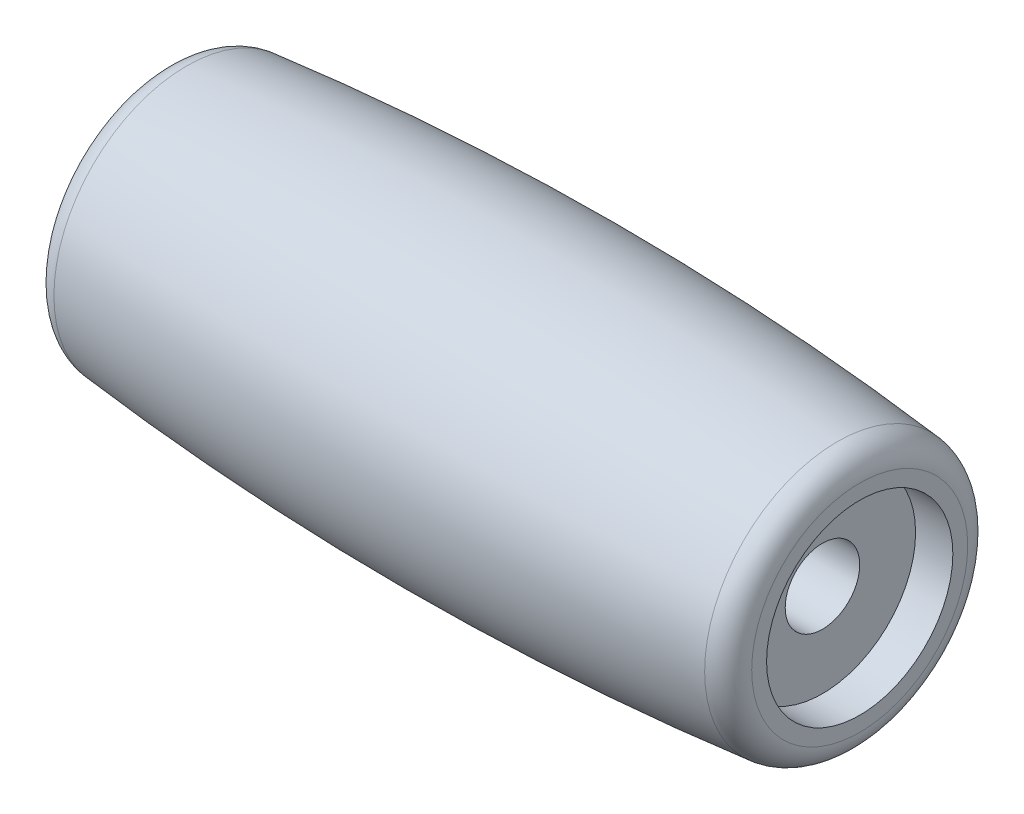
ISO-10303-21;
HEADER;
FILE_DESCRIPTION(('STEP AP214'),'2;1');
FILE_NAME('part.step','',(''),(''),'','','');
FILE_SCHEMA(('AUTOMOTIVE_DESIGN { 1 0 10303 214 1 1 1 1 }'));
ENDSEC;
DATA;
#1=APPLICATION_CONTEXT('core data for automotive mechanical design processes');
#2=APPLICATION_PROTOCOL_DEFINITION('international standard','automotive_design',2000,#1);
#3=PRODUCT_CONTEXT('',#1,'mechanical');
#4=PRODUCT('Part','Part','',(#3));
#5=PRODUCT_RELATED_PRODUCT_CATEGORY('part','',(#4));
#6=PRODUCT_DEFINITION_FORMATION('','',#4);
#7=PRODUCT_DEFINITION_CONTEXT('part definition',#1,'design');
#8=PRODUCT_DEFINITION('design','',#6,#7);
#9=PRODUCT_DEFINITION_SHAPE('','',#8);
#10=(LENGTH_UNIT() NAMED_UNIT(*) SI_UNIT(.MILLI.,.METRE.));
#11=(NAMED_UNIT(*) PLANE_ANGLE_UNIT() SI_UNIT($,.RADIAN.));
#12=(NAMED_UNIT(*) SI_UNIT($,.STERADIAN.) SOLID_ANGLE_UNIT());
#13=UNCERTAINTY_MEASURE_WITH_UNIT(LENGTH_MEASURE(1.E-05),#10,'distance_accuracy_value','');
#14=(GEOMETRIC_REPRESENTATION_CONTEXT(3) GLOBAL_UNCERTAINTY_ASSIGNED_CONTEXT((#13)) GLOBAL_UNIT_ASSIGNED_CONTEXT((#10,
#11,#12)) REPRESENTATION_CONTEXT('',''));
#15=CARTESIAN_POINT('',(0.,0.,0.));
#16=DIRECTION('',(0.,0.,1.));
#17=DIRECTION('',(1.,0.,0.));
#18=AXIS2_PLACEMENT_3D('',#15,#16,#17);
#19=CARTESIAN_POINT('',(12.5,1.5,0.));
#20=DIRECTION('',(-1.,0.,0.));
#21=DIRECTION('',(0.,0.,1.));
#22=AXIS2_PLACEMENT_3D('',#19,#20,#21);
#23=PLANE('',#22);
#24=CARTESIAN_POINT('',(12.5,0.,0.));
#25=DIRECTION('',(-1.,0.,0.));
#26=DIRECTION('',(0.,0.,1.));
#27=AXIS2_PLACEMENT_3D('',#24,#25,#26);
#28=CIRCLE('',#27,3.75);
#29=CARTESIAN_POINT('',(12.5,0.,3.75));
#30=VERTEX_POINT('',#29);
#31=EDGE_CURVE('E10',#30,#30,#28,.T.);
#32=ORIENTED_EDGE('',*,*,#31,.F.);
#33=EDGE_LOOP('',(#32));
#34=FACE_BOUND('',#33,.T.);
#35=CARTESIAN_POINT('',(12.5,0.,0.));
#36=DIRECTION('',(-1.,0.,0.));
#37=DIRECTION('',(0.,0.,1.));
#38=AXIS2_PLACEMENT_3D('',#35,#36,#37);
#39=CIRCLE('',#38,1.5);
#40=CARTESIAN_POINT('',(12.5,0.,1.5));
#41=VERTEX_POINT('',#40);
#42=EDGE_CURVE('E71',#41,#41,#39,.T.);
#43=ORIENTED_EDGE('',*,*,#42,.T.);
#44=EDGE_LOOP('',(#43));
#45=FACE_BOUND('',#44,.T.);
#46=ADVANCED_FACE('F37',(#34,#45),#23,.F.);
#47=CARTESIAN_POINT('',(0.,0.,0.));
#48=DIRECTION('',(-1.,0.,0.));
#49=DIRECTION('',(0.,0.,1.));
#50=AXIS2_PLACEMENT_3D('',#47,#48,#49);
#51=CYLINDRICAL_SURFACE('',#50,3.75);
#52=CARTESIAN_POINT('',(14.,0.,0.));
#53=DIRECTION('',(-1.,0.,0.));
#54=DIRECTION('',(0.,0.,1.));
#55=AXIS2_PLACEMENT_3D('',#52,#53,#54);
#56=CIRCLE('',#55,3.75);
#57=CARTESIAN_POINT('',(14.,0.,3.75));
#58=VERTEX_POINT('',#57);
#59=EDGE_CURVE('E43',#58,#58,#56,.T.);
#60=ORIENTED_EDGE('',*,*,#59,.F.);
#61=EDGE_LOOP('',(#60));
#62=FACE_BOUND('',#61,.T.);
#63=ORIENTED_EDGE('',*,*,#31,.T.);
#64=EDGE_LOOP('',(#63));
#65=FACE_BOUND('',#64,.T.);
#66=ADVANCED_FACE('F120',(#62,#65),#51,.F.);
#67=CARTESIAN_POINT('',(14.,3.75,0.));
#68=DIRECTION('',(-1.,0.,0.));
#69=DIRECTION('',(0.,0.,1.));
#70=AXIS2_PLACEMENT_3D('',#67,#68,#69);
#71=PLANE('',#70);
#72=CARTESIAN_POINT('',(14.,0.,0.));
#73=DIRECTION('',(-1.,0.,0.));
#74=DIRECTION('',(0.,0.,1.));
#75=AXIS2_PLACEMENT_3D('',#72,#73,#74);
#76=CIRCLE('',#75,4.34857666506391);
#77=CARTESIAN_POINT('',(14.,0.,4.34857666506391));
#78=VERTEX_POINT('',#77);
#79=EDGE_CURVE('E47',#78,#78,#76,.T.);
#80=ORIENTED_EDGE('',*,*,#79,.F.);
#81=EDGE_LOOP('',(#80));
#82=FACE_BOUND('',#81,.T.);
#83=ORIENTED_EDGE('',*,*,#59,.T.);
#84=EDGE_LOOP('',(#83));
#85=FACE_BOUND('',#84,.T.);
#86=ADVANCED_FACE('F115',(#82,#85),#71,.F.);
#87=CARTESIAN_POINT('',(13.,0.,0.));
#88=DIRECTION('',(-1.,0.,0.));
#89=DIRECTION('',(0.,0.,1.));
#90=AXIS2_PLACEMENT_3D('',#87,#88,#89);
#91=TOROIDAL_SURFACE('',#90,4.34857666506391,1.);
#92=CARTESIAN_POINT('',(13.0999679589875,0.,0.));
#93=DIRECTION('',(-1.,0.,0.));
#94=DIRECTION('',(0.,0.,1.));
#95=AXIS2_PLACEMENT_3D('',#92,#93,#94);
#96=CIRCLE('',#95,5.34356732189231);
#97=CARTESIAN_POINT('',(13.0999679589875,0.,5.34356732189231));
#98=VERTEX_POINT('',#97);
#99=EDGE_CURVE('E51',#98,#98,#96,.T.);
#100=ORIENTED_EDGE('',*,*,#99,.F.);
#101=EDGE_LOOP('',(#100));
#102=FACE_BOUND('',#101,.T.);
#103=ORIENTED_EDGE('',*,*,#79,.T.);
#104=EDGE_LOOP('',(#103));
#105=FACE_BOUND('',#104,.T.);
#106=ADVANCED_FACE('F109',(#102,#105),#91,.T.);
#107=CARTESIAN_POINT('',(0.,0.,0.));
#108=DIRECTION('',(-1.,0.,0.));
#109=DIRECTION('',(0.,0.,1.));
#110=AXIS2_PLACEMENT_3D('',#107,#108,#109);
#111=DEGENERATE_TOROIDAL_SURFACE('',#110,125.041666666666,131.041666666666,.F.);
#112=CARTESIAN_POINT('',(-13.0999679589875,0.,0.));
#113=DIRECTION('',(-1.,0.,0.));
#114=DIRECTION('',(0.,0.,1.));
#115=AXIS2_PLACEMENT_3D('',#112,#113,#114);
#116=CIRCLE('',#115,5.34356732189232);
#117=CARTESIAN_POINT('',(-13.0999679589875,0.,5.34356732189232));
#118=VERTEX_POINT('',#117);
#119=EDGE_CURVE('E56',#118,#118,#116,.T.);
#120=ORIENTED_EDGE('',*,*,#119,.F.);
#121=EDGE_LOOP('',(#120));
#122=FACE_BOUND('',#121,.T.);
#123=ORIENTED_EDGE('',*,*,#99,.T.);
#124=EDGE_LOOP('',(#123));
#125=FACE_BOUND('',#124,.T.);
#126=ADVANCED_FACE('F103',(#122,#125),#111,.F.);
#127=CARTESIAN_POINT('',(-13.,0.,0.));
#128=DIRECTION('',(-1.,0.,0.));
#129=DIRECTION('',(0.,0.,1.));
#130=AXIS2_PLACEMENT_3D('',#127,#128,#129);
#131=TOROIDAL_SURFACE('',#130,4.34857666506388,1.00000000000001);
#132=CARTESIAN_POINT('',(-14.,0.,0.));
#133=DIRECTION('',(-1.,0.,0.));
#134=DIRECTION('',(0.,0.,1.));
#135=AXIS2_PLACEMENT_3D('',#132,#133,#134);
#136=CIRCLE('',#135,4.34857666506388);
#137=CARTESIAN_POINT('',(-14.,0.,4.34857666506388));
#138=VERTEX_POINT('',#137);
#139=EDGE_CURVE('E59',#138,#138,#136,.T.);
#140=ORIENTED_EDGE('',*,*,#139,.F.);
#141=EDGE_LOOP('',(#140));
#142=FACE_BOUND('',#141,.T.);
#143=ORIENTED_EDGE('',*,*,#119,.T.);
#144=EDGE_LOOP('',(#143));
#145=FACE_BOUND('',#144,.T.);
#146=ADVANCED_FACE('F97',(#142,#145),#131,.T.);
#147=CARTESIAN_POINT('',(-14.,3.75,0.));
#148=DIRECTION('',(1.,0.,0.));
#149=DIRECTION('',(0.,0.,-1.));
#150=AXIS2_PLACEMENT_3D('',#147,#148,#149);
#151=PLANE('',#150);
#152=CARTESIAN_POINT('',(-14.,0.,0.));
#153=DIRECTION('',(-1.,0.,0.));
#154=DIRECTION('',(0.,0.,1.));
#155=AXIS2_PLACEMENT_3D('',#152,#153,#154);
#156=CIRCLE('',#155,3.75);
#157=CARTESIAN_POINT('',(-14.,0.,3.75));
#158=VERTEX_POINT('',#157);
#159=EDGE_CURVE('E62',#158,#158,#156,.T.);
#160=ORIENTED_EDGE('',*,*,#159,.F.);
#161=EDGE_LOOP('',(#160));
#162=FACE_BOUND('',#161,.T.);
#163=ORIENTED_EDGE('',*,*,#139,.T.);
#164=EDGE_LOOP('',(#163));
#165=FACE_BOUND('',#164,.T.);
#166=ADVANCED_FACE('F91',(#162,#165),#151,.F.);
#167=CARTESIAN_POINT('',(0.,0.,0.));
#168=DIRECTION('',(-1.,0.,0.));
#169=DIRECTION('',(0.,0.,1.));
#170=AXIS2_PLACEMENT_3D('',#167,#168,#169);
#171=CYLINDRICAL_SURFACE('',#170,3.75);
#172=CARTESIAN_POINT('',(-12.5,0.,0.));
#173=DIRECTION('',(-1.,0.,0.));
#174=DIRECTION('',(0.,0.,1.));
#175=AXIS2_PLACEMENT_3D('',#172,#173,#174);
#176=CIRCLE('',#175,3.75);
#177=CARTESIAN_POINT('',(-12.5,0.,3.75));
#178=VERTEX_POINT('',#177);
#179=EDGE_CURVE('E65',#178,#178,#176,.T.);
#180=ORIENTED_EDGE('',*,*,#179,.F.);
#181=EDGE_LOOP('',(#180));
#182=FACE_BOUND('',#181,.T.);
#183=ORIENTED_EDGE('',*,*,#159,.T.);
#184=EDGE_LOOP('',(#183));
#185=FACE_BOUND('',#184,.T.);
#186=ADVANCED_FACE('F85',(#182,#185),#171,.F.);
#187=CARTESIAN_POINT('',(-12.5,1.5,0.));
#188=DIRECTION('',(1.,0.,0.));
#189=DIRECTION('',(0.,0.,-1.));
#190=AXIS2_PLACEMENT_3D('',#187,#188,#189);
#191=PLANE('',#190);
#192=CARTESIAN_POINT('',(-12.5,0.,0.));
#193=DIRECTION('',(-1.,0.,0.));
#194=DIRECTION('',(0.,0.,1.));
#195=AXIS2_PLACEMENT_3D('',#192,#193,#194);
#196=CIRCLE('',#195,1.5);
#197=CARTESIAN_POINT('',(-12.5,0.,1.5));
#198=VERTEX_POINT('',#197);
#199=EDGE_CURVE('E68',#198,#198,#196,.T.);
#200=ORIENTED_EDGE('',*,*,#199,.F.);
#201=EDGE_LOOP('',(#200));
#202=FACE_BOUND('',#201,.T.);
#203=ORIENTED_EDGE('',*,*,#179,.T.);
#204=EDGE_LOOP('',(#203));
#205=FACE_BOUND('',#204,.T.);
#206=ADVANCED_FACE('F79',(#202,#205),#191,.F.);
#207=CARTESIAN_POINT('',(0.,0.,0.));
#208=DIRECTION('',(-1.,0.,0.));
#209=DIRECTION('',(0.,0.,1.));
#210=AXIS2_PLACEMENT_3D('',#207,#208,#209);
#211=CYLINDRICAL_SURFACE('',#210,1.5);
#212=ORIENTED_EDGE('',*,*,#42,.F.);
#213=EDGE_LOOP('',(#212));
#214=FACE_BOUND('',#213,.T.);
#215=ORIENTED_EDGE('',*,*,#199,.T.);
#216=EDGE_LOOP('',(#215));
#217=FACE_BOUND('',#216,.T.);
#218=ADVANCED_FACE('F76',(#214,#217),#211,.F.);
#219=CLOSED_SHELL('',(#46,#66,#86,#106,#126,#146,#166,#186,#206,#218));
#220=MANIFOLD_SOLID_BREP('B2',#219);
#221=ADVANCED_BREP_SHAPE_REPRESENTATION('',(#18,#220),#14);
#222=SHAPE_DEFINITION_REPRESENTATION(#9,#221);
ENDSEC;
END-ISO-10303-21;
